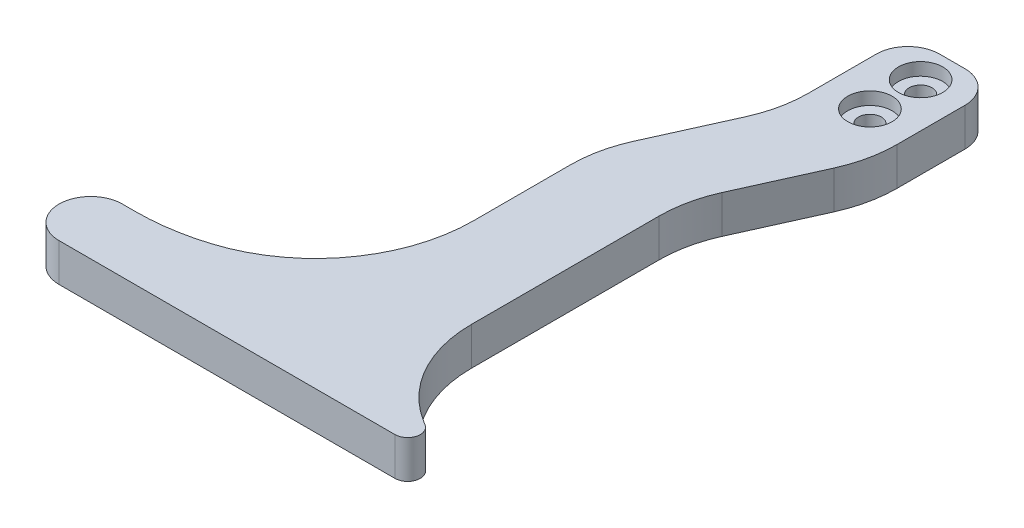
ISO-10303-21;
HEADER;
FILE_DESCRIPTION(('STEP AP214'),'2;1');
FILE_NAME('part.step','',(''),(''),'','','');
FILE_SCHEMA(('AUTOMOTIVE_DESIGN { 1 0 10303 214 1 1 1 1 }'));
ENDSEC;
DATA;
#1=APPLICATION_CONTEXT('core data for automotive mechanical design processes');
#2=APPLICATION_PROTOCOL_DEFINITION('international standard','automotive_design',2000,#1);
#3=PRODUCT_CONTEXT('',#1,'mechanical');
#4=PRODUCT('Part','Part','',(#3));
#5=PRODUCT_RELATED_PRODUCT_CATEGORY('part','',(#4));
#6=PRODUCT_DEFINITION_FORMATION('','',#4);
#7=PRODUCT_DEFINITION_CONTEXT('part definition',#1,'design');
#8=PRODUCT_DEFINITION('design','',#6,#7);
#9=PRODUCT_DEFINITION_SHAPE('','',#8);
#10=(LENGTH_UNIT() NAMED_UNIT(*) SI_UNIT(.MILLI.,.METRE.));
#11=(NAMED_UNIT(*) PLANE_ANGLE_UNIT() SI_UNIT($,.RADIAN.));
#12=(NAMED_UNIT(*) SI_UNIT($,.STERADIAN.) SOLID_ANGLE_UNIT());
#13=UNCERTAINTY_MEASURE_WITH_UNIT(LENGTH_MEASURE(1.E-05),#10,'distance_accuracy_value','');
#14=(GEOMETRIC_REPRESENTATION_CONTEXT(3) GLOBAL_UNCERTAINTY_ASSIGNED_CONTEXT((#13)) GLOBAL_UNIT_ASSIGNED_CONTEXT((#10,
#11,#12)) REPRESENTATION_CONTEXT('',''));
#15=CARTESIAN_POINT('',(0.,0.,0.));
#16=DIRECTION('',(0.,0.,1.));
#17=DIRECTION('',(1.,0.,0.));
#18=AXIS2_PLACEMENT_3D('',#15,#16,#17);
#19=CARTESIAN_POINT('',(8.89,7.62,6.34999999999999));
#20=DIRECTION('',(0.,-1.,0.));
#21=DIRECTION('',(0.,0.,-1.));
#22=AXIS2_PLACEMENT_3D('',#19,#20,#21);
#23=CYLINDRICAL_SURFACE('',#22,2.286);
#24=CARTESIAN_POINT('',(8.89,0.,6.34999999999999));
#25=DIRECTION('',(0.,1.,0.));
#26=DIRECTION('',(0.,0.,1.));
#27=AXIS2_PLACEMENT_3D('',#24,#25,#26);
#28=CIRCLE('',#27,2.286);
#29=CARTESIAN_POINT('',(8.89,0.,8.63599999999999));
#30=VERTEX_POINT('',#29);
#31=EDGE_CURVE('E423',#30,#30,#28,.T.);
#32=ORIENTED_EDGE('',*,*,#31,.F.);
#33=EDGE_LOOP('',(#32));
#34=FACE_BOUND('',#33,.T.);
#35=CARTESIAN_POINT('',(8.89,5.08,6.34999999999999));
#36=DIRECTION('',(0.,1.,0.));
#37=DIRECTION('',(0.,0.,1.));
#38=AXIS2_PLACEMENT_3D('',#35,#36,#37);
#39=CIRCLE('',#38,2.286);
#40=CARTESIAN_POINT('',(8.89,5.08,8.63599999999999));
#41=VERTEX_POINT('',#40);
#42=EDGE_CURVE('E360',#41,#41,#39,.T.);
#43=ORIENTED_EDGE('',*,*,#42,.T.);
#44=EDGE_LOOP('',(#43));
#45=FACE_BOUND('',#44,.T.);
#46=ADVANCED_FACE('F43',(#34,#45),#23,.F.);
#47=CARTESIAN_POINT('',(8.89,7.62,16.51));
#48=DIRECTION('',(0.,-1.,0.));
#49=DIRECTION('',(0.,0.,-1.));
#50=AXIS2_PLACEMENT_3D('',#47,#48,#49);
#51=CYLINDRICAL_SURFACE('',#50,2.286);
#52=CARTESIAN_POINT('',(8.89,0.,16.51));
#53=DIRECTION('',(0.,1.,0.));
#54=DIRECTION('',(0.,0.,1.));
#55=AXIS2_PLACEMENT_3D('',#52,#53,#54);
#56=CIRCLE('',#55,2.286);
#57=CARTESIAN_POINT('',(8.89,0.,18.796));
#58=VERTEX_POINT('',#57);
#59=EDGE_CURVE('E359',#58,#58,#56,.T.);
#60=ORIENTED_EDGE('',*,*,#59,.F.);
#61=EDGE_LOOP('',(#60));
#62=FACE_BOUND('',#61,.T.);
#63=CARTESIAN_POINT('',(8.89,5.08,16.51));
#64=DIRECTION('',(0.,1.,0.));
#65=DIRECTION('',(0.,0.,1.));
#66=AXIS2_PLACEMENT_3D('',#63,#64,#65);
#67=CIRCLE('',#66,2.286);
#68=CARTESIAN_POINT('',(8.89,5.08,18.796));
#69=VERTEX_POINT('',#68);
#70=EDGE_CURVE('E374',#69,#69,#67,.T.);
#71=ORIENTED_EDGE('',*,*,#70,.T.);
#72=EDGE_LOOP('',(#71));
#73=FACE_BOUND('',#72,.T.);
#74=ADVANCED_FACE('F533',(#62,#73),#51,.F.);
#75=CARTESIAN_POINT('',(0.,7.62,0.));
#76=DIRECTION('',(0.,-1.,0.));
#77=DIRECTION('',(0.,0.,-1.));
#78=AXIS2_PLACEMENT_3D('',#75,#76,#77);
#79=PLANE('',#78);
#80=CARTESIAN_POINT('',(8.89,7.62,6.34999999999999));
#81=DIRECTION('',(0.,1.,0.));
#82=DIRECTION('',(0.,0.,1.));
#83=AXIS2_PLACEMENT_3D('',#80,#81,#82);
#84=CIRCLE('',#83,4.445);
#85=CARTESIAN_POINT('',(8.89,7.62,10.795));
#86=VERTEX_POINT('',#85);
#87=EDGE_CURVE('E841',#86,#86,#84,.T.);
#88=ORIENTED_EDGE('',*,*,#87,.F.);
#89=EDGE_LOOP('',(#88));
#90=FACE_BOUND('',#89,.T.);
#91=CARTESIAN_POINT('',(8.89,7.62,16.51));
#92=DIRECTION('',(0.,1.,0.));
#93=DIRECTION('',(0.,0.,1.));
#94=AXIS2_PLACEMENT_3D('',#91,#92,#93);
#95=CIRCLE('',#94,4.445);
#96=CARTESIAN_POINT('',(8.89,7.62,20.955));
#97=VERTEX_POINT('',#96);
#98=EDGE_CURVE('E845',#97,#97,#95,.T.);
#99=ORIENTED_EDGE('',*,*,#98,.F.);
#100=EDGE_LOOP('',(#99));
#101=FACE_BOUND('',#100,.T.);
#102=DIRECTION('',(1.,0.,0.));
#103=VECTOR('',#102,1.);
#104=CARTESIAN_POINT('',(26.67,7.62,120.65));
#105=LINE('',#104,#103);
#106=CARTESIAN_POINT('',(-49.53,7.62,120.65));
#107=VERTEX_POINT('',#106);
#108=CARTESIAN_POINT('',(17.8135375849153,7.62,120.65));
#109=VERTEX_POINT('',#108);
#110=EDGE_CURVE('E403',#107,#109,#105,.T.);
#111=ORIENTED_EDGE('',*,*,#110,.T.);
#112=CARTESIAN_POINT('',(17.8135375849153,7.62,118.11));
#113=DIRECTION('',(0.,-1.,0.));
#114=DIRECTION('',(0.,0.,-1.));
#115=AXIS2_PLACEMENT_3D('',#112,#113,#114);
#116=CIRCLE('',#115,2.54);
#117=CARTESIAN_POINT('',(19.1597348925233,7.62,115.956084307827));
#118=VERTEX_POINT('',#117);
#119=EDGE_CURVE('E11',#109,#118,#116,.F.);
#120=ORIENTED_EDGE('',*,*,#119,.T.);
#121=DIRECTION('',(-0.847998304005088,0.,-0.52999894000318));
#122=VECTOR('',#121,1.);
#123=CARTESIAN_POINT('',(6.35,7.62,107.95));
#124=LINE('',#123,#122);
#125=CARTESIAN_POINT('',(18.2880269239192,7.62,115.41126682745));
#126=VERTEX_POINT('',#125);
#127=EDGE_CURVE('E400',#118,#126,#124,.T.);
#128=ORIENTED_EDGE('',*,*,#127,.T.);
#129=CARTESIAN_POINT('',(31.75,7.62,93.8721099057203));
#130=DIRECTION('',(0.,-1.,0.));
#131=DIRECTION('',(0.,0.,-1.));
#132=AXIS2_PLACEMENT_3D('',#129,#130,#131);
#133=CIRCLE('',#132,25.4);
#134=CARTESIAN_POINT('',(6.35,7.62,93.8721099057203));
#135=VERTEX_POINT('',#134);
#136=EDGE_CURVE('E203',#126,#135,#133,.T.);
#137=ORIENTED_EDGE('',*,*,#136,.T.);
#138=DIRECTION('',(0.,0.,-1.));
#139=VECTOR('',#138,1.);
#140=CARTESIAN_POINT('',(6.35,7.62,50.8));
#141=LINE('',#140,#139);
#142=CARTESIAN_POINT('',(6.35,7.62,56.2517210962575));
#143=VERTEX_POINT('',#142);
#144=EDGE_CURVE('E213',#135,#143,#141,.T.);
#145=ORIENTED_EDGE('',*,*,#144,.T.);
#146=CARTESIAN_POINT('',(31.75,7.62,56.2517210962575));
#147=DIRECTION('',(0.,-1.,0.));
#148=DIRECTION('',(0.,0.,-1.));
#149=AXIS2_PLACEMENT_3D('',#146,#147,#148);
#150=CIRCLE('',#149,25.4);
#151=CARTESIAN_POINT('',(8.58719376855229,7.62,45.828458292106));
#152=VERTEX_POINT('',#151);
#153=EDGE_CURVE('E288',#143,#152,#150,.T.);
#154=ORIENTED_EDGE('',*,*,#153,.T.);
#155=DIRECTION('',(0.410364677328798,0.,-0.911921505175106));
#156=VECTOR('',#155,1.);
#157=CARTESIAN_POINT('',(17.78,7.62,25.4));
#158=LINE('',#157,#156);
#159=CARTESIAN_POINT('',(15.5428062314477,7.62,30.371541707894));
#160=VERTEX_POINT('',#159);
#161=EDGE_CURVE('E394',#152,#160,#158,.T.);
#162=ORIENTED_EDGE('',*,*,#161,.T.);
#163=CARTESIAN_POINT('',(-7.62000000000001,7.62,19.9482789037425));
#164=DIRECTION('',(0.,-1.,0.));
#165=DIRECTION('',(0.,0.,-1.));
#166=AXIS2_PLACEMENT_3D('',#163,#164,#165);
#167=CIRCLE('',#166,25.4);
#168=CARTESIAN_POINT('',(17.78,7.62,19.9482789037425));
#169=VERTEX_POINT('',#168);
#170=EDGE_CURVE('E264',#160,#169,#167,.F.);
#171=ORIENTED_EDGE('',*,*,#170,.T.);
#172=DIRECTION('',(0.,0.,-1.));
#173=VECTOR('',#172,1.);
#174=CARTESIAN_POINT('',(17.78,7.62,0.));
#175=LINE('',#174,#173);
#176=CARTESIAN_POINT('',(17.78,7.62,6.35));
#177=VERTEX_POINT('',#176);
#178=EDGE_CURVE('E390',#169,#177,#175,.T.);
#179=ORIENTED_EDGE('',*,*,#178,.T.);
#180=CARTESIAN_POINT('',(11.43,7.62,6.35));
#181=DIRECTION('',(0.,-1.,0.));
#182=DIRECTION('',(0.,0.,-1.));
#183=AXIS2_PLACEMENT_3D('',#180,#181,#182);
#184=CIRCLE('',#183,6.35);
#185=CARTESIAN_POINT('',(11.43,7.62,0.));
#186=VERTEX_POINT('',#185);
#187=EDGE_CURVE('E328',#177,#186,#184,.F.);
#188=ORIENTED_EDGE('',*,*,#187,.T.);
#189=DIRECTION('',(-1.,0.,0.));
#190=VECTOR('',#189,1.);
#191=CARTESIAN_POINT('',(0.,7.62,0.));
#192=LINE('',#191,#190);
#193=CARTESIAN_POINT('',(6.35,7.62,0.));
#194=VERTEX_POINT('',#193);
#195=EDGE_CURVE('E243',#186,#194,#192,.T.);
#196=ORIENTED_EDGE('',*,*,#195,.T.);
#197=CARTESIAN_POINT('',(6.35,7.62,6.35));
#198=DIRECTION('',(0.,-1.,0.));
#199=DIRECTION('',(0.,0.,-1.));
#200=AXIS2_PLACEMENT_3D('',#197,#198,#199);
#201=CIRCLE('',#200,6.35);
#202=CARTESIAN_POINT('',(0.,7.62,6.35));
#203=VERTEX_POINT('',#202);
#204=EDGE_CURVE('E325',#194,#203,#201,.F.);
#205=ORIENTED_EDGE('',*,*,#204,.T.);
#206=DIRECTION('',(0.,0.,1.));
#207=VECTOR('',#206,1.);
#208=CARTESIAN_POINT('',(0.,7.62,25.4));
#209=LINE('',#208,#207);
#210=CARTESIAN_POINT('',(0.,7.62,19.9482789037425));
#211=VERTEX_POINT('',#210);
#212=EDGE_CURVE('E241',#203,#211,#209,.T.);
#213=ORIENTED_EDGE('',*,*,#212,.T.);
#214=CARTESIAN_POINT('',(-25.4,7.62,19.9482789037425));
#215=DIRECTION('',(0.,-1.,0.));
#216=DIRECTION('',(0.,0.,-1.));
#217=AXIS2_PLACEMENT_3D('',#214,#215,#216);
#218=CIRCLE('',#217,25.4);
#219=CARTESIAN_POINT('',(-2.2371937685523,7.62,30.371541707894));
#220=VERTEX_POINT('',#219);
#221=EDGE_CURVE('E295',#211,#220,#218,.T.);
#222=ORIENTED_EDGE('',*,*,#221,.T.);
#223=DIRECTION('',(-0.410364677328798,0.,0.911921505175106));
#224=VECTOR('',#223,1.);
#225=CARTESIAN_POINT('',(0.,7.62,25.4));
#226=LINE('',#225,#224);
#227=CARTESIAN_POINT('',(-9.1928062314477,7.62,45.828458292106));
#228=VERTEX_POINT('',#227);
#229=EDGE_CURVE('E414',#220,#228,#226,.T.);
#230=ORIENTED_EDGE('',*,*,#229,.T.);
#231=CARTESIAN_POINT('',(13.97,7.62,56.2517210962575));
#232=DIRECTION('',(0.,-1.,0.));
#233=DIRECTION('',(0.,0.,-1.));
#234=AXIS2_PLACEMENT_3D('',#231,#232,#233);
#235=CIRCLE('',#234,25.4);
#236=CARTESIAN_POINT('',(-11.43,7.62,56.2517210962575));
#237=VERTEX_POINT('',#236);
#238=EDGE_CURVE('E267',#228,#237,#235,.F.);
#239=ORIENTED_EDGE('',*,*,#238,.T.);
#240=DIRECTION('',(0.,0.,1.));
#241=VECTOR('',#240,1.);
#242=CARTESIAN_POINT('',(-11.43,7.62,50.8));
#243=LINE('',#242,#241);
#244=CARTESIAN_POINT('',(-11.43,7.62,75.6150278579952));
#245=VERTEX_POINT('',#244);
#246=EDGE_CURVE('E410',#237,#245,#243,.T.);
#247=ORIENTED_EDGE('',*,*,#246,.T.);
#248=CARTESIAN_POINT('',(-43.18,7.62,75.6150278579952));
#249=DIRECTION('',(0.,-1.,0.));
#250=DIRECTION('',(0.,0.,-1.));
#251=AXIS2_PLACEMENT_3D('',#248,#249,#250);
#252=CIRCLE('',#251,31.75);
#253=CARTESIAN_POINT('',(-33.655,7.62,105.902597502983));
#254=VERTEX_POINT('',#253);
#255=EDGE_CURVE('E370',#245,#254,#252,.T.);
#256=ORIENTED_EDGE('',*,*,#255,.T.);
#257=CARTESIAN_POINT('',(-46.99,7.62,63.5));
#258=DIRECTION('',(0.,-1.,0.));
#259=DIRECTION('',(0.,0.,-1.));
#260=AXIS2_PLACEMENT_3D('',#257,#258,#259);
#261=CIRCLE('',#260,44.45);
#262=CARTESIAN_POINT('',(-46.99,7.62,107.95));
#263=VERTEX_POINT('',#262);
#264=EDGE_CURVE('E306',#254,#263,#261,.T.);
#265=ORIENTED_EDGE('',*,*,#264,.T.);
#266=DIRECTION('',(-1.,0.,0.));
#267=VECTOR('',#266,1.);
#268=CARTESIAN_POINT('',(-55.88,7.62,107.95));
#269=LINE('',#268,#267);
#270=CARTESIAN_POINT('',(-49.53,7.62,107.95));
#271=VERTEX_POINT('',#270);
#272=EDGE_CURVE('E406',#263,#271,#269,.T.);
#273=ORIENTED_EDGE('',*,*,#272,.T.);
#274=CARTESIAN_POINT('',(-49.53,7.62,114.3));
#275=DIRECTION('',(0.,-1.,0.));
#276=DIRECTION('',(0.,0.,-1.));
#277=AXIS2_PLACEMENT_3D('',#274,#275,#276);
#278=CIRCLE('',#277,6.35);
#279=CARTESIAN_POINT('',(-55.88,7.62,114.3));
#280=VERTEX_POINT('',#279);
#281=EDGE_CURVE('E331',#271,#280,#278,.F.);
#282=ORIENTED_EDGE('',*,*,#281,.T.);
#283=CARTESIAN_POINT('',(-49.53,7.62,114.3));
#284=DIRECTION('',(0.,-1.,0.));
#285=DIRECTION('',(0.,0.,-1.));
#286=AXIS2_PLACEMENT_3D('',#283,#284,#285);
#287=CIRCLE('',#286,6.35);
#288=EDGE_CURVE('E334',#280,#107,#287,.F.);
#289=ORIENTED_EDGE('',*,*,#288,.T.);
#290=EDGE_LOOP('',(#111,#120,#128,#137,#145,#154,#162,#171,#179,#188,#196,#205,#213,#222,#230,
#239,#247,#256,#265,#273,#282,#289));
#291=FACE_BOUND('',#290,.T.);
#292=ADVANCED_FACE('F447',(#90,#101,#291),#79,.F.);
#293=CARTESIAN_POINT('',(0.,0.,0.));
#294=DIRECTION('',(0.,-1.,0.));
#295=DIRECTION('',(0.,0.,-1.));
#296=AXIS2_PLACEMENT_3D('',#293,#294,#295);
#297=PLANE('',#296);
#298=ORIENTED_EDGE('',*,*,#31,.T.);
#299=EDGE_LOOP('',(#298));
#300=FACE_BOUND('',#299,.T.);
#301=DIRECTION('',(-0.847998304005088,0.,-0.52999894000318));
#302=VECTOR('',#301,1.);
#303=CARTESIAN_POINT('',(6.35,0.,107.95));
#304=LINE('',#303,#302);
#305=CARTESIAN_POINT('',(19.1597348925233,0.,115.956084307827));
#306=VERTEX_POINT('',#305);
#307=CARTESIAN_POINT('',(18.2880269239192,0.,115.41126682745));
#308=VERTEX_POINT('',#307);
#309=EDGE_CURVE('E223',#306,#308,#304,.T.);
#310=ORIENTED_EDGE('',*,*,#309,.F.);
#311=CARTESIAN_POINT('',(17.8135375849153,0.,118.11));
#312=DIRECTION('',(0.,-1.,0.));
#313=DIRECTION('',(0.,0.,-1.));
#314=AXIS2_PLACEMENT_3D('',#311,#312,#313);
#315=CIRCLE('',#314,2.54);
#316=CARTESIAN_POINT('',(17.8135375849153,0.,120.65));
#317=VERTEX_POINT('',#316);
#318=EDGE_CURVE('E66',#306,#317,#315,.T.);
#319=ORIENTED_EDGE('',*,*,#318,.T.);
#320=DIRECTION('',(1.,0.,0.));
#321=VECTOR('',#320,1.);
#322=CARTESIAN_POINT('',(26.67,0.,120.65));
#323=LINE('',#322,#321);
#324=CARTESIAN_POINT('',(-49.53,0.,120.65));
#325=VERTEX_POINT('',#324);
#326=EDGE_CURVE('E230',#325,#317,#323,.T.);
#327=ORIENTED_EDGE('',*,*,#326,.F.);
#328=CARTESIAN_POINT('',(-49.53,0.,114.3));
#329=DIRECTION('',(0.,-1.,0.));
#330=DIRECTION('',(0.,0.,-1.));
#331=AXIS2_PLACEMENT_3D('',#328,#329,#330);
#332=CIRCLE('',#331,6.35);
#333=CARTESIAN_POINT('',(-55.88,0.,114.3));
#334=VERTEX_POINT('',#333);
#335=EDGE_CURVE('E322',#325,#334,#332,.T.);
#336=ORIENTED_EDGE('',*,*,#335,.T.);
#337=CARTESIAN_POINT('',(-49.53,0.,114.3));
#338=DIRECTION('',(0.,-1.,0.));
#339=DIRECTION('',(0.,0.,-1.));
#340=AXIS2_PLACEMENT_3D('',#337,#338,#339);
#341=CIRCLE('',#340,6.35);
#342=CARTESIAN_POINT('',(-49.53,0.,107.95));
#343=VERTEX_POINT('',#342);
#344=EDGE_CURVE('E319',#334,#343,#341,.T.);
#345=ORIENTED_EDGE('',*,*,#344,.T.);
#346=DIRECTION('',(-1.,0.,0.));
#347=VECTOR('',#346,1.);
#348=CARTESIAN_POINT('',(-55.88,0.,107.95));
#349=LINE('',#348,#347);
#350=CARTESIAN_POINT('',(-46.99,0.,107.95));
#351=VERTEX_POINT('',#350);
#352=EDGE_CURVE('E437',#351,#343,#349,.T.);
#353=ORIENTED_EDGE('',*,*,#352,.F.);
#354=CARTESIAN_POINT('',(-46.99,0.,63.5));
#355=DIRECTION('',(0.,-1.,0.));
#356=DIRECTION('',(0.,0.,-1.));
#357=AXIS2_PLACEMENT_3D('',#354,#355,#356);
#358=CIRCLE('',#357,44.45);
#359=CARTESIAN_POINT('',(-33.655,0.,105.902597502983));
#360=VERTEX_POINT('',#359);
#361=EDGE_CURVE('E302',#351,#360,#358,.F.);
#362=ORIENTED_EDGE('',*,*,#361,.T.);
#363=CARTESIAN_POINT('',(-43.18,0.,75.6150278579952));
#364=DIRECTION('',(0.,-1.,0.));
#365=DIRECTION('',(0.,0.,-1.));
#366=AXIS2_PLACEMENT_3D('',#363,#364,#365);
#367=CIRCLE('',#366,31.75);
#368=CARTESIAN_POINT('',(-11.43,0.,75.6150278579952));
#369=VERTEX_POINT('',#368);
#370=EDGE_CURVE('E367',#360,#369,#367,.F.);
#371=ORIENTED_EDGE('',*,*,#370,.T.);
#372=DIRECTION('',(0.,0.,1.));
#373=VECTOR('',#372,1.);
#374=CARTESIAN_POINT('',(-11.43,0.,50.8));
#375=LINE('',#374,#373);
#376=CARTESIAN_POINT('',(-11.43,0.,56.2517210962575));
#377=VERTEX_POINT('',#376);
#378=EDGE_CURVE('E433',#377,#369,#375,.T.);
#379=ORIENTED_EDGE('',*,*,#378,.F.);
#380=CARTESIAN_POINT('',(13.97,0.,56.2517210962575));
#381=DIRECTION('',(0.,-1.,0.));
#382=DIRECTION('',(0.,0.,-1.));
#383=AXIS2_PLACEMENT_3D('',#380,#381,#382);
#384=CIRCLE('',#383,25.4);
#385=CARTESIAN_POINT('',(-9.1928062314477,0.,45.828458292106));
#386=VERTEX_POINT('',#385);
#387=EDGE_CURVE('E254',#377,#386,#384,.T.);
#388=ORIENTED_EDGE('',*,*,#387,.T.);
#389=DIRECTION('',(-0.410364677328798,0.,0.911921505175106));
#390=VECTOR('',#389,1.);
#391=CARTESIAN_POINT('',(0.,0.,25.4));
#392=LINE('',#391,#390);
#393=CARTESIAN_POINT('',(-2.2371937685523,0.,30.371541707894));
#394=VERTEX_POINT('',#393);
#395=EDGE_CURVE('E429',#394,#386,#392,.T.);
#396=ORIENTED_EDGE('',*,*,#395,.F.);
#397=CARTESIAN_POINT('',(-25.4,0.,19.9482789037425));
#398=DIRECTION('',(0.,-1.,0.));
#399=DIRECTION('',(0.,0.,-1.));
#400=AXIS2_PLACEMENT_3D('',#397,#398,#399);
#401=CIRCLE('',#400,25.4);
#402=CARTESIAN_POINT('',(0.,0.,19.9482789037425));
#403=VERTEX_POINT('',#402);
#404=EDGE_CURVE('E291',#394,#403,#401,.F.);
#405=ORIENTED_EDGE('',*,*,#404,.T.);
#406=DIRECTION('',(0.,0.,1.));
#407=VECTOR('',#406,1.);
#408=CARTESIAN_POINT('',(0.,0.,25.4));
#409=LINE('',#408,#407);
#410=CARTESIAN_POINT('',(0.,0.,6.35));
#411=VERTEX_POINT('',#410);
#412=EDGE_CURVE('E426',#411,#403,#409,.T.);
#413=ORIENTED_EDGE('',*,*,#412,.F.);
#414=CARTESIAN_POINT('',(6.35,0.,6.35));
#415=DIRECTION('',(0.,-1.,0.));
#416=DIRECTION('',(0.,0.,-1.));
#417=AXIS2_PLACEMENT_3D('',#414,#415,#416);
#418=CIRCLE('',#417,6.35);
#419=CARTESIAN_POINT('',(6.35,0.,0.));
#420=VERTEX_POINT('',#419);
#421=EDGE_CURVE('E313',#411,#420,#418,.T.);
#422=ORIENTED_EDGE('',*,*,#421,.T.);
#423=DIRECTION('',(-1.,0.,0.));
#424=VECTOR('',#423,1.);
#425=CARTESIAN_POINT('',(0.,0.,0.));
#426=LINE('',#425,#424);
#427=CARTESIAN_POINT('',(11.43,0.,0.));
#428=VERTEX_POINT('',#427);
#429=EDGE_CURVE('E237',#428,#420,#426,.T.);
#430=ORIENTED_EDGE('',*,*,#429,.F.);
#431=CARTESIAN_POINT('',(11.43,0.,6.35));
#432=DIRECTION('',(0.,-1.,0.));
#433=DIRECTION('',(0.,0.,-1.));
#434=AXIS2_PLACEMENT_3D('',#431,#432,#433);
#435=CIRCLE('',#434,6.35);
#436=CARTESIAN_POINT('',(17.78,0.,6.35));
#437=VERTEX_POINT('',#436);
#438=EDGE_CURVE('E316',#428,#437,#435,.T.);
#439=ORIENTED_EDGE('',*,*,#438,.T.);
#440=DIRECTION('',(0.,0.,-1.));
#441=VECTOR('',#440,1.);
#442=CARTESIAN_POINT('',(17.78,0.,0.));
#443=LINE('',#442,#441);
#444=CARTESIAN_POINT('',(17.78,0.,19.9482789037425));
#445=VERTEX_POINT('',#444);
#446=EDGE_CURVE('E228',#445,#437,#443,.T.);
#447=ORIENTED_EDGE('',*,*,#446,.F.);
#448=CARTESIAN_POINT('',(-7.62000000000001,0.,19.9482789037425));
#449=DIRECTION('',(0.,-1.,0.));
#450=DIRECTION('',(0.,0.,-1.));
#451=AXIS2_PLACEMENT_3D('',#448,#449,#450);
#452=CIRCLE('',#451,25.4);
#453=CARTESIAN_POINT('',(15.5428062314477,0.,30.371541707894));
#454=VERTEX_POINT('',#453);
#455=EDGE_CURVE('E251',#445,#454,#452,.T.);
#456=ORIENTED_EDGE('',*,*,#455,.T.);
#457=DIRECTION('',(0.410364677328798,0.,-0.911921505175106));
#458=VECTOR('',#457,1.);
#459=CARTESIAN_POINT('',(17.78,0.,25.4));
#460=LINE('',#459,#458);
#461=CARTESIAN_POINT('',(8.58719376855229,0.,45.828458292106));
#462=VERTEX_POINT('',#461);
#463=EDGE_CURVE('E222',#462,#454,#460,.T.);
#464=ORIENTED_EDGE('',*,*,#463,.F.);
#465=CARTESIAN_POINT('',(31.75,0.,56.2517210962575));
#466=DIRECTION('',(0.,-1.,0.));
#467=DIRECTION('',(0.,0.,-1.));
#468=AXIS2_PLACEMENT_3D('',#465,#466,#467);
#469=CIRCLE('',#468,25.4);
#470=CARTESIAN_POINT('',(6.35,0.,56.2517210962575));
#471=VERTEX_POINT('',#470);
#472=EDGE_CURVE('E220',#462,#471,#469,.F.);
#473=ORIENTED_EDGE('',*,*,#472,.T.);
#474=DIRECTION('',(0.,0.,-1.));
#475=VECTOR('',#474,1.);
#476=CARTESIAN_POINT('',(6.35,0.,50.8));
#477=LINE('',#476,#475);
#478=CARTESIAN_POINT('',(6.35,0.,93.8721099057203));
#479=VERTEX_POINT('',#478);
#480=EDGE_CURVE('E210',#479,#471,#477,.T.);
#481=ORIENTED_EDGE('',*,*,#480,.F.);
#482=CARTESIAN_POINT('',(31.75,0.,93.8721099057203));
#483=DIRECTION('',(0.,-1.,0.));
#484=DIRECTION('',(0.,0.,-1.));
#485=AXIS2_PLACEMENT_3D('',#482,#483,#484);
#486=CIRCLE('',#485,25.4);
#487=EDGE_CURVE('E194',#479,#308,#486,.F.);
#488=ORIENTED_EDGE('',*,*,#487,.T.);
#489=EDGE_LOOP('',(#310,#319,#327,#336,#345,#353,#362,#371,#379,#388,#396,#405,#413,#422,#430,
#439,#447,#456,#464,#473,#481,#488));
#490=FACE_BOUND('',#489,.T.);
#491=ORIENTED_EDGE('',*,*,#59,.T.);
#492=EDGE_LOOP('',(#491));
#493=FACE_BOUND('',#492,.T.);
#494=ADVANCED_FACE('F217',(#300,#490,#493),#297,.T.);
#495=CARTESIAN_POINT('',(0.,7.62,25.4));
#496=DIRECTION('',(1.,0.,0.));
#497=DIRECTION('',(0.,0.,-1.));
#498=AXIS2_PLACEMENT_3D('',#495,#496,#497);
#499=PLANE('',#498);
#500=ORIENTED_EDGE('',*,*,#212,.F.);
#501=DIRECTION('',(0.,-1.,0.));
#502=VECTOR('',#501,1.);
#503=CARTESIAN_POINT('',(0.,7.62,6.35));
#504=LINE('',#503,#502);
#505=EDGE_CURVE('E350',#203,#411,#504,.T.);
#506=ORIENTED_EDGE('',*,*,#505,.T.);
#507=ORIENTED_EDGE('',*,*,#412,.T.);
#508=DIRECTION('',(0.,-1.,0.));
#509=VECTOR('',#508,1.);
#510=CARTESIAN_POINT('',(0.,7.62,19.9482789037425));
#511=LINE('',#510,#509);
#512=EDGE_CURVE('E204',#403,#211,#511,.F.);
#513=ORIENTED_EDGE('',*,*,#512,.T.);
#514=EDGE_LOOP('',(#500,#506,#507,#513));
#515=FACE_BOUND('',#514,.T.);
#516=ADVANCED_FACE('F482',(#515),#499,.F.);
#517=CARTESIAN_POINT('',(0.,7.62,25.4));
#518=DIRECTION('',(0.911921505175106,0.,0.410364677328798));
#519=DIRECTION('',(0.410364677328798,0.,-0.911921505175106));
#520=AXIS2_PLACEMENT_3D('',#517,#518,#519);
#521=PLANE('',#520);
#522=ORIENTED_EDGE('',*,*,#395,.T.);
#523=DIRECTION('',(0.,-1.,0.));
#524=VECTOR('',#523,1.);
#525=CARTESIAN_POINT('',(-9.1928062314477,7.62,45.828458292106));
#526=LINE('',#525,#524);
#527=EDGE_CURVE('E261',#386,#228,#526,.F.);
#528=ORIENTED_EDGE('',*,*,#527,.T.);
#529=ORIENTED_EDGE('',*,*,#229,.F.);
#530=DIRECTION('',(0.,-1.,0.));
#531=VECTOR('',#530,1.);
#532=CARTESIAN_POINT('',(-2.2371937685523,0.,30.371541707894));
#533=LINE('',#532,#531);
#534=EDGE_CURVE('E257',#220,#394,#533,.T.);
#535=ORIENTED_EDGE('',*,*,#534,.T.);
#536=EDGE_LOOP('',(#522,#528,#529,#535));
#537=FACE_BOUND('',#536,.T.);
#538=ADVANCED_FACE('F491',(#537),#521,.F.);
#539=CARTESIAN_POINT('',(-11.43,7.62,50.8));
#540=DIRECTION('',(1.,0.,0.));
#541=DIRECTION('',(0.,0.,-1.));
#542=AXIS2_PLACEMENT_3D('',#539,#540,#541);
#543=PLANE('',#542);
#544=ORIENTED_EDGE('',*,*,#378,.T.);
#545=DIRECTION('',(0.,1.,0.));
#546=VECTOR('',#545,1.);
#547=CARTESIAN_POINT('',(-11.43,7.62,75.6150278579952));
#548=LINE('',#547,#546);
#549=EDGE_CURVE('E364',#369,#245,#548,.T.);
#550=ORIENTED_EDGE('',*,*,#549,.T.);
#551=ORIENTED_EDGE('',*,*,#246,.F.);
#552=DIRECTION('',(0.,-1.,0.));
#553=VECTOR('',#552,1.);
#554=CARTESIAN_POINT('',(-11.43,7.62,56.2517210962575));
#555=LINE('',#554,#553);
#556=EDGE_CURVE('E247',#237,#377,#555,.T.);
#557=ORIENTED_EDGE('',*,*,#556,.T.);
#558=EDGE_LOOP('',(#544,#550,#551,#557));
#559=FACE_BOUND('',#558,.T.);
#560=ADVANCED_FACE('F500',(#559),#543,.F.);
#561=CARTESIAN_POINT('',(-55.88,7.62,107.95));
#562=DIRECTION('',(0.,0.,1.));
#563=DIRECTION('',(1.,0.,0.));
#564=AXIS2_PLACEMENT_3D('',#561,#562,#563);
#565=PLANE('',#564);
#566=ORIENTED_EDGE('',*,*,#352,.T.);
#567=DIRECTION('',(0.,-1.,0.));
#568=VECTOR('',#567,1.);
#569=CARTESIAN_POINT('',(-49.53,7.62,107.95));
#570=LINE('',#569,#568);
#571=EDGE_CURVE('E337',#343,#271,#570,.F.);
#572=ORIENTED_EDGE('',*,*,#571,.T.);
#573=ORIENTED_EDGE('',*,*,#272,.F.);
#574=DIRECTION('',(0.,-1.,0.));
#575=VECTOR('',#574,1.);
#576=CARTESIAN_POINT('',(-46.99,7.62,107.95));
#577=LINE('',#576,#575);
#578=EDGE_CURVE('E298',#263,#351,#577,.T.);
#579=ORIENTED_EDGE('',*,*,#578,.T.);
#580=EDGE_LOOP('',(#566,#572,#573,#579));
#581=FACE_BOUND('',#580,.T.);
#582=ADVANCED_FACE('F513',(#581),#565,.F.);
#583=CARTESIAN_POINT('',(26.67,7.62,120.65));
#584=DIRECTION('',(0.,0.,-1.));
#585=DIRECTION('',(-1.,0.,0.));
#586=AXIS2_PLACEMENT_3D('',#583,#584,#585);
#587=PLANE('',#586);
#588=ORIENTED_EDGE('',*,*,#326,.T.);
#589=DIRECTION('',(0.,-1.,0.));
#590=VECTOR('',#589,1.);
#591=CARTESIAN_POINT('',(17.8135375849153,7.62,120.65));
#592=LINE('',#591,#590);
#593=EDGE_CURVE('E52',#317,#109,#592,.F.);
#594=ORIENTED_EDGE('',*,*,#593,.T.);
#595=ORIENTED_EDGE('',*,*,#110,.F.);
#596=DIRECTION('',(0.,-1.,0.));
#597=VECTOR('',#596,1.);
#598=CARTESIAN_POINT('',(-49.53,7.62,120.65));
#599=LINE('',#598,#597);
#600=EDGE_CURVE('E309',#107,#325,#599,.T.);
#601=ORIENTED_EDGE('',*,*,#600,.T.);
#602=EDGE_LOOP('',(#588,#594,#595,#601));
#603=FACE_BOUND('',#602,.T.);
#604=ADVANCED_FACE('F441',(#603),#587,.F.);
#605=CARTESIAN_POINT('',(6.35,7.62,107.95));
#606=DIRECTION('',(-0.52999894000318,0.,0.847998304005088));
#607=DIRECTION('',(0.847998304005088,0.,0.52999894000318));
#608=AXIS2_PLACEMENT_3D('',#605,#606,#607);
#609=PLANE('',#608);
#610=ORIENTED_EDGE('',*,*,#127,.F.);
#611=DIRECTION('',(0.,-1.,0.));
#612=VECTOR('',#611,1.);
#613=CARTESIAN_POINT('',(19.1597348925233,7.62,115.956084307827));
#614=LINE('',#613,#612);
#615=EDGE_CURVE('E373',#118,#306,#614,.T.);
#616=ORIENTED_EDGE('',*,*,#615,.T.);
#617=ORIENTED_EDGE('',*,*,#309,.T.);
#618=DIRECTION('',(0.,-1.,0.));
#619=VECTOR('',#618,1.);
#620=CARTESIAN_POINT('',(18.2880269239192,7.62,115.41126682745));
#621=LINE('',#620,#619);
#622=EDGE_CURVE('E200',#308,#126,#621,.F.);
#623=ORIENTED_EDGE('',*,*,#622,.T.);
#624=EDGE_LOOP('',(#610,#616,#617,#623));
#625=FACE_BOUND('',#624,.T.);
#626=ADVANCED_FACE('F449',(#625),#609,.F.);
#627=CARTESIAN_POINT('',(6.35,7.62,50.8));
#628=DIRECTION('',(-1.,0.,0.));
#629=DIRECTION('',(0.,0.,1.));
#630=AXIS2_PLACEMENT_3D('',#627,#628,#629);
#631=PLANE('',#630);
#632=ORIENTED_EDGE('',*,*,#144,.F.);
#633=DIRECTION('',(0.,-1.,0.));
#634=VECTOR('',#633,1.);
#635=CARTESIAN_POINT('',(6.35,0.,93.8721099057203));
#636=LINE('',#635,#634);
#637=EDGE_CURVE('E198',#135,#479,#636,.T.);
#638=ORIENTED_EDGE('',*,*,#637,.T.);
#639=ORIENTED_EDGE('',*,*,#480,.T.);
#640=DIRECTION('',(0.,-1.,0.));
#641=VECTOR('',#640,1.);
#642=CARTESIAN_POINT('',(6.35,7.62,56.2517210962575));
#643=LINE('',#642,#641);
#644=EDGE_CURVE('E215',#471,#143,#643,.F.);
#645=ORIENTED_EDGE('',*,*,#644,.T.);
#646=EDGE_LOOP('',(#632,#638,#639,#645));
#647=FACE_BOUND('',#646,.T.);
#648=ADVANCED_FACE('F209',(#647),#631,.F.);
#649=CARTESIAN_POINT('',(17.78,7.62,25.4));
#650=DIRECTION('',(-0.911921505175106,0.,-0.410364677328798));
#651=DIRECTION('',(-0.410364677328798,0.,0.911921505175106));
#652=AXIS2_PLACEMENT_3D('',#649,#650,#651);
#653=PLANE('',#652);
#654=ORIENTED_EDGE('',*,*,#463,.T.);
#655=DIRECTION('',(0.,-1.,0.));
#656=VECTOR('',#655,1.);
#657=CARTESIAN_POINT('',(15.5428062314477,7.62,30.371541707894));
#658=LINE('',#657,#656);
#659=EDGE_CURVE('E278',#454,#160,#658,.F.);
#660=ORIENTED_EDGE('',*,*,#659,.T.);
#661=ORIENTED_EDGE('',*,*,#161,.F.);
#662=DIRECTION('',(0.,-1.,0.));
#663=VECTOR('',#662,1.);
#664=CARTESIAN_POINT('',(8.58719376855229,0.,45.828458292106));
#665=LINE('',#664,#663);
#666=EDGE_CURVE('E274',#152,#462,#665,.T.);
#667=ORIENTED_EDGE('',*,*,#666,.T.);
#668=EDGE_LOOP('',(#654,#660,#661,#667));
#669=FACE_BOUND('',#668,.T.);
#670=ADVANCED_FACE('F456',(#669),#653,.F.);
#671=CARTESIAN_POINT('',(17.78,7.62,0.));
#672=DIRECTION('',(-1.,0.,0.));
#673=DIRECTION('',(0.,0.,1.));
#674=AXIS2_PLACEMENT_3D('',#671,#672,#673);
#675=PLANE('',#674);
#676=ORIENTED_EDGE('',*,*,#446,.T.);
#677=DIRECTION('',(0.,-1.,0.));
#678=VECTOR('',#677,1.);
#679=CARTESIAN_POINT('',(17.78,7.62,6.35));
#680=LINE('',#679,#678);
#681=EDGE_CURVE('E347',#437,#177,#680,.F.);
#682=ORIENTED_EDGE('',*,*,#681,.T.);
#683=ORIENTED_EDGE('',*,*,#178,.F.);
#684=DIRECTION('',(0.,-1.,0.));
#685=VECTOR('',#684,1.);
#686=CARTESIAN_POINT('',(17.78,7.62,19.9482789037425));
#687=LINE('',#686,#685);
#688=EDGE_CURVE('E270',#169,#445,#687,.T.);
#689=ORIENTED_EDGE('',*,*,#688,.T.);
#690=EDGE_LOOP('',(#676,#682,#683,#689));
#691=FACE_BOUND('',#690,.T.);
#692=ADVANCED_FACE('F465',(#691),#675,.F.);
#693=CARTESIAN_POINT('',(0.,7.62,0.));
#694=DIRECTION('',(0.,0.,1.));
#695=DIRECTION('',(1.,0.,0.));
#696=AXIS2_PLACEMENT_3D('',#693,#694,#695);
#697=PLANE('',#696);
#698=ORIENTED_EDGE('',*,*,#195,.F.);
#699=DIRECTION('',(0.,-1.,0.));
#700=VECTOR('',#699,1.);
#701=CARTESIAN_POINT('',(11.43,7.62,0.));
#702=LINE('',#701,#700);
#703=EDGE_CURVE('E343',#186,#428,#702,.T.);
#704=ORIENTED_EDGE('',*,*,#703,.T.);
#705=ORIENTED_EDGE('',*,*,#429,.T.);
#706=DIRECTION('',(0.,-1.,0.));
#707=VECTOR('',#706,1.);
#708=CARTESIAN_POINT('',(6.35,7.62,0.));
#709=LINE('',#708,#707);
#710=EDGE_CURVE('E340',#420,#194,#709,.F.);
#711=ORIENTED_EDGE('',*,*,#710,.T.);
#712=EDGE_LOOP('',(#698,#704,#705,#711));
#713=FACE_BOUND('',#712,.T.);
#714=ADVANCED_FACE('F474',(#713),#697,.F.);
#715=CARTESIAN_POINT('',(31.75,7.62,93.8721099057203));
#716=DIRECTION('',(0.,1.,0.));
#717=DIRECTION('',(0.,0.,1.));
#718=AXIS2_PLACEMENT_3D('',#715,#716,#717);
#719=CYLINDRICAL_SURFACE('',#718,25.4);
#720=ORIENTED_EDGE('',*,*,#136,.F.);
#721=ORIENTED_EDGE('',*,*,#622,.F.);
#722=ORIENTED_EDGE('',*,*,#487,.F.);
#723=ORIENTED_EDGE('',*,*,#637,.F.);
#724=EDGE_LOOP('',(#720,#721,#722,#723));
#725=FACE_BOUND('',#724,.T.);
#726=ADVANCED_FACE('F197',(#725),#719,.F.);
#727=CARTESIAN_POINT('',(13.97,7.62,56.2517210962575));
#728=DIRECTION('',(0.,-1.,0.));
#729=DIRECTION('',(0.,0.,-1.));
#730=AXIS2_PLACEMENT_3D('',#727,#728,#729);
#731=CYLINDRICAL_SURFACE('',#730,25.4);
#732=ORIENTED_EDGE('',*,*,#238,.F.);
#733=ORIENTED_EDGE('',*,*,#527,.F.);
#734=ORIENTED_EDGE('',*,*,#387,.F.);
#735=ORIENTED_EDGE('',*,*,#556,.F.);
#736=EDGE_LOOP('',(#732,#733,#734,#735));
#737=FACE_BOUND('',#736,.T.);
#738=ADVANCED_FACE('F495',(#737),#731,.T.);
#739=CARTESIAN_POINT('',(-7.62000000000001,7.62,19.9482789037425));
#740=DIRECTION('',(0.,-1.,0.));
#741=DIRECTION('',(0.,0.,-1.));
#742=AXIS2_PLACEMENT_3D('',#739,#740,#741);
#743=CYLINDRICAL_SURFACE('',#742,25.4);
#744=ORIENTED_EDGE('',*,*,#170,.F.);
#745=ORIENTED_EDGE('',*,*,#659,.F.);
#746=ORIENTED_EDGE('',*,*,#455,.F.);
#747=ORIENTED_EDGE('',*,*,#688,.F.);
#748=EDGE_LOOP('',(#744,#745,#746,#747));
#749=FACE_BOUND('',#748,.T.);
#750=ADVANCED_FACE('F462',(#749),#743,.T.);
#751=CARTESIAN_POINT('',(31.75,7.62,56.2517210962575));
#752=DIRECTION('',(0.,1.,0.));
#753=DIRECTION('',(0.,0.,1.));
#754=AXIS2_PLACEMENT_3D('',#751,#752,#753);
#755=CYLINDRICAL_SURFACE('',#754,25.4);
#756=ORIENTED_EDGE('',*,*,#153,.F.);
#757=ORIENTED_EDGE('',*,*,#644,.F.);
#758=ORIENTED_EDGE('',*,*,#472,.F.);
#759=ORIENTED_EDGE('',*,*,#666,.F.);
#760=EDGE_LOOP('',(#756,#757,#758,#759));
#761=FACE_BOUND('',#760,.T.);
#762=ADVANCED_FACE('F454',(#761),#755,.F.);
#763=CARTESIAN_POINT('',(-25.4,7.62,19.9482789037425));
#764=DIRECTION('',(0.,1.,0.));
#765=DIRECTION('',(0.,0.,1.));
#766=AXIS2_PLACEMENT_3D('',#763,#764,#765);
#767=CYLINDRICAL_SURFACE('',#766,25.4);
#768=ORIENTED_EDGE('',*,*,#221,.F.);
#769=ORIENTED_EDGE('',*,*,#512,.F.);
#770=ORIENTED_EDGE('',*,*,#404,.F.);
#771=ORIENTED_EDGE('',*,*,#534,.F.);
#772=EDGE_LOOP('',(#768,#769,#770,#771));
#773=FACE_BOUND('',#772,.T.);
#774=ADVANCED_FACE('F487',(#773),#767,.F.);
#775=CARTESIAN_POINT('',(-46.99,7.62,63.5));
#776=DIRECTION('',(0.,-1.,0.));
#777=DIRECTION('',(0.,0.,-1.));
#778=AXIS2_PLACEMENT_3D('',#775,#776,#777);
#779=CYLINDRICAL_SURFACE('',#778,44.45);
#780=ORIENTED_EDGE('',*,*,#264,.F.);
#781=DIRECTION('',(0.,-1.,0.));
#782=VECTOR('',#781,1.);
#783=CARTESIAN_POINT('',(-33.655,7.62,105.902597502983));
#784=LINE('',#783,#782);
#785=EDGE_CURVE('E354',#254,#360,#784,.T.);
#786=ORIENTED_EDGE('',*,*,#785,.T.);
#787=ORIENTED_EDGE('',*,*,#361,.F.);
#788=ORIENTED_EDGE('',*,*,#578,.F.);
#789=EDGE_LOOP('',(#780,#786,#787,#788));
#790=FACE_BOUND('',#789,.T.);
#791=ADVANCED_FACE('F510',(#790),#779,.F.);
#792=CARTESIAN_POINT('',(-49.53,7.62,114.3));
#793=DIRECTION('',(0.,-1.,0.));
#794=DIRECTION('',(0.,0.,-1.));
#795=AXIS2_PLACEMENT_3D('',#792,#793,#794);
#796=CYLINDRICAL_SURFACE('',#795,6.35);
#797=DIRECTION('',(0.,-1.,0.));
#798=VECTOR('',#797,1.);
#799=CARTESIAN_POINT('',(-55.88,7.62,114.3));
#800=LINE('',#799,#798);
#801=EDGE_CURVE('E355',#280,#334,#800,.T.);
#802=ORIENTED_EDGE('',*,*,#801,.F.);
#803=ORIENTED_EDGE('',*,*,#281,.F.);
#804=ORIENTED_EDGE('',*,*,#571,.F.);
#805=ORIENTED_EDGE('',*,*,#344,.F.);
#806=EDGE_LOOP('',(#802,#803,#804,#805));
#807=FACE_BOUND('',#806,.T.);
#808=ADVANCED_FACE('F518',(#807),#796,.T.);
#809=CARTESIAN_POINT('',(-49.53,7.62,114.3));
#810=DIRECTION('',(0.,-1.,0.));
#811=DIRECTION('',(0.,0.,-1.));
#812=AXIS2_PLACEMENT_3D('',#809,#810,#811);
#813=CYLINDRICAL_SURFACE('',#812,6.35);
#814=ORIENTED_EDGE('',*,*,#288,.F.);
#815=ORIENTED_EDGE('',*,*,#801,.T.);
#816=ORIENTED_EDGE('',*,*,#335,.F.);
#817=ORIENTED_EDGE('',*,*,#600,.F.);
#818=EDGE_LOOP('',(#814,#815,#816,#817));
#819=FACE_BOUND('',#818,.T.);
#820=ADVANCED_FACE('F522',(#819),#813,.T.);
#821=CARTESIAN_POINT('',(11.43,7.62,6.35));
#822=DIRECTION('',(0.,-1.,0.));
#823=DIRECTION('',(0.,0.,-1.));
#824=AXIS2_PLACEMENT_3D('',#821,#822,#823);
#825=CYLINDRICAL_SURFACE('',#824,6.35);
#826=ORIENTED_EDGE('',*,*,#187,.F.);
#827=ORIENTED_EDGE('',*,*,#681,.F.);
#828=ORIENTED_EDGE('',*,*,#438,.F.);
#829=ORIENTED_EDGE('',*,*,#703,.F.);
#830=EDGE_LOOP('',(#826,#827,#828,#829));
#831=FACE_BOUND('',#830,.T.);
#832=ADVANCED_FACE('F471',(#831),#825,.T.);
#833=CARTESIAN_POINT('',(6.35,7.62,6.35));
#834=DIRECTION('',(0.,-1.,0.));
#835=DIRECTION('',(0.,0.,-1.));
#836=AXIS2_PLACEMENT_3D('',#833,#834,#835);
#837=CYLINDRICAL_SURFACE('',#836,6.35);
#838=ORIENTED_EDGE('',*,*,#204,.F.);
#839=ORIENTED_EDGE('',*,*,#710,.F.);
#840=ORIENTED_EDGE('',*,*,#421,.F.);
#841=ORIENTED_EDGE('',*,*,#505,.F.);
#842=EDGE_LOOP('',(#838,#839,#840,#841));
#843=FACE_BOUND('',#842,.T.);
#844=ADVANCED_FACE('F480',(#843),#837,.T.);
#845=CARTESIAN_POINT('',(-43.18,7.62,75.6150278579952));
#846=DIRECTION('',(0.,-1.,0.));
#847=DIRECTION('',(0.,0.,-1.));
#848=AXIS2_PLACEMENT_3D('',#845,#846,#847);
#849=CYLINDRICAL_SURFACE('',#848,31.75);
#850=ORIENTED_EDGE('',*,*,#255,.F.);
#851=ORIENTED_EDGE('',*,*,#549,.F.);
#852=ORIENTED_EDGE('',*,*,#370,.F.);
#853=ORIENTED_EDGE('',*,*,#785,.F.);
#854=EDGE_LOOP('',(#850,#851,#852,#853));
#855=FACE_BOUND('',#854,.T.);
#856=ADVANCED_FACE('F504',(#855),#849,.F.);
#857=CARTESIAN_POINT('',(8.89,5.08,16.51));
#858=DIRECTION('',(0.,1.,0.));
#859=DIRECTION('',(0.,0.,1.));
#860=AXIS2_PLACEMENT_3D('',#857,#858,#859);
#861=CYLINDRICAL_SURFACE('',#860,4.445);
#862=CARTESIAN_POINT('',(8.89,5.08,16.51));
#863=DIRECTION('',(0.,1.,0.));
#864=DIRECTION('',(0.,0.,1.));
#865=AXIS2_PLACEMENT_3D('',#862,#863,#864);
#866=CIRCLE('',#865,4.445);
#867=CARTESIAN_POINT('',(8.89,5.08,20.955));
#868=VERTEX_POINT('',#867);
#869=EDGE_CURVE('E851',#868,#868,#866,.T.);
#870=ORIENTED_EDGE('',*,*,#869,.F.);
#871=EDGE_LOOP('',(#870));
#872=FACE_BOUND('',#871,.T.);
#873=ORIENTED_EDGE('',*,*,#98,.T.);
#874=EDGE_LOOP('',(#873));
#875=FACE_BOUND('',#874,.T.);
#876=ADVANCED_FACE('F707',(#872,#875),#861,.F.);
#877=CARTESIAN_POINT('',(8.89,5.08,16.51));
#878=DIRECTION('',(0.,1.,0.));
#879=DIRECTION('',(0.,0.,1.));
#880=AXIS2_PLACEMENT_3D('',#877,#878,#879);
#881=PLANE('',#880);
#882=ORIENTED_EDGE('',*,*,#70,.F.);
#883=EDGE_LOOP('',(#882));
#884=FACE_BOUND('',#883,.T.);
#885=ORIENTED_EDGE('',*,*,#869,.T.);
#886=EDGE_LOOP('',(#885));
#887=FACE_BOUND('',#886,.T.);
#888=ADVANCED_FACE('F712',(#884,#887),#881,.T.);
#889=CARTESIAN_POINT('',(8.89,5.08,6.34999999999999));
#890=DIRECTION('',(0.,1.,0.));
#891=DIRECTION('',(0.,0.,1.));
#892=AXIS2_PLACEMENT_3D('',#889,#890,#891);
#893=CYLINDRICAL_SURFACE('',#892,4.445);
#894=CARTESIAN_POINT('',(8.89,5.08,6.34999999999999));
#895=DIRECTION('',(0.,1.,0.));
#896=DIRECTION('',(0.,0.,1.));
#897=AXIS2_PLACEMENT_3D('',#894,#895,#896);
#898=CIRCLE('',#897,4.445);
#899=CARTESIAN_POINT('',(8.89,5.08,10.795));
#900=VERTEX_POINT('',#899);
#901=EDGE_CURVE('E378',#900,#900,#898,.T.);
#902=ORIENTED_EDGE('',*,*,#901,.F.);
#903=EDGE_LOOP('',(#902));
#904=FACE_BOUND('',#903,.T.);
#905=ORIENTED_EDGE('',*,*,#87,.T.);
#906=EDGE_LOOP('',(#905));
#907=FACE_BOUND('',#906,.T.);
#908=ADVANCED_FACE('F724',(#904,#907),#893,.F.);
#909=CARTESIAN_POINT('',(8.89,5.08,6.34999999999999));
#910=DIRECTION('',(0.,1.,0.));
#911=DIRECTION('',(0.,0.,1.));
#912=AXIS2_PLACEMENT_3D('',#909,#910,#911);
#913=PLANE('',#912);
#914=ORIENTED_EDGE('',*,*,#42,.F.);
#915=EDGE_LOOP('',(#914));
#916=FACE_BOUND('',#915,.T.);
#917=ORIENTED_EDGE('',*,*,#901,.T.);
#918=EDGE_LOOP('',(#917));
#919=FACE_BOUND('',#918,.T.);
#920=ADVANCED_FACE('F733',(#916,#919),#913,.T.);
#921=CARTESIAN_POINT('',(17.8135375849153,7.62,118.11));
#922=DIRECTION('',(0.,-1.,0.));
#923=DIRECTION('',(0.,0.,-1.));
#924=AXIS2_PLACEMENT_3D('',#921,#922,#923);
#925=CYLINDRICAL_SURFACE('',#924,2.54);
#926=ORIENTED_EDGE('',*,*,#119,.F.);
#927=ORIENTED_EDGE('',*,*,#593,.F.);
#928=ORIENTED_EDGE('',*,*,#318,.F.);
#929=ORIENTED_EDGE('',*,*,#615,.F.);
#930=EDGE_LOOP('',(#926,#927,#928,#929));
#931=FACE_BOUND('',#930,.T.);
#932=ADVANCED_FACE('F45',(#931),#925,.T.);
#933=CLOSED_SHELL('',(#46,#74,#292,#494,#516,#538,#560,#582,#604,#626,#648,#670,#692,#714,#726,
#738,#750,#762,#774,#791,#808,#820,#832,#844,#856,#876,#888,#908,#920,#932));
#934=MANIFOLD_SOLID_BREP('B2',#933);
#935=ADVANCED_BREP_SHAPE_REPRESENTATION('',(#18,#934),#14);
#936=SHAPE_DEFINITION_REPRESENTATION(#9,#935);
ENDSEC;
END-ISO-10303-21;
